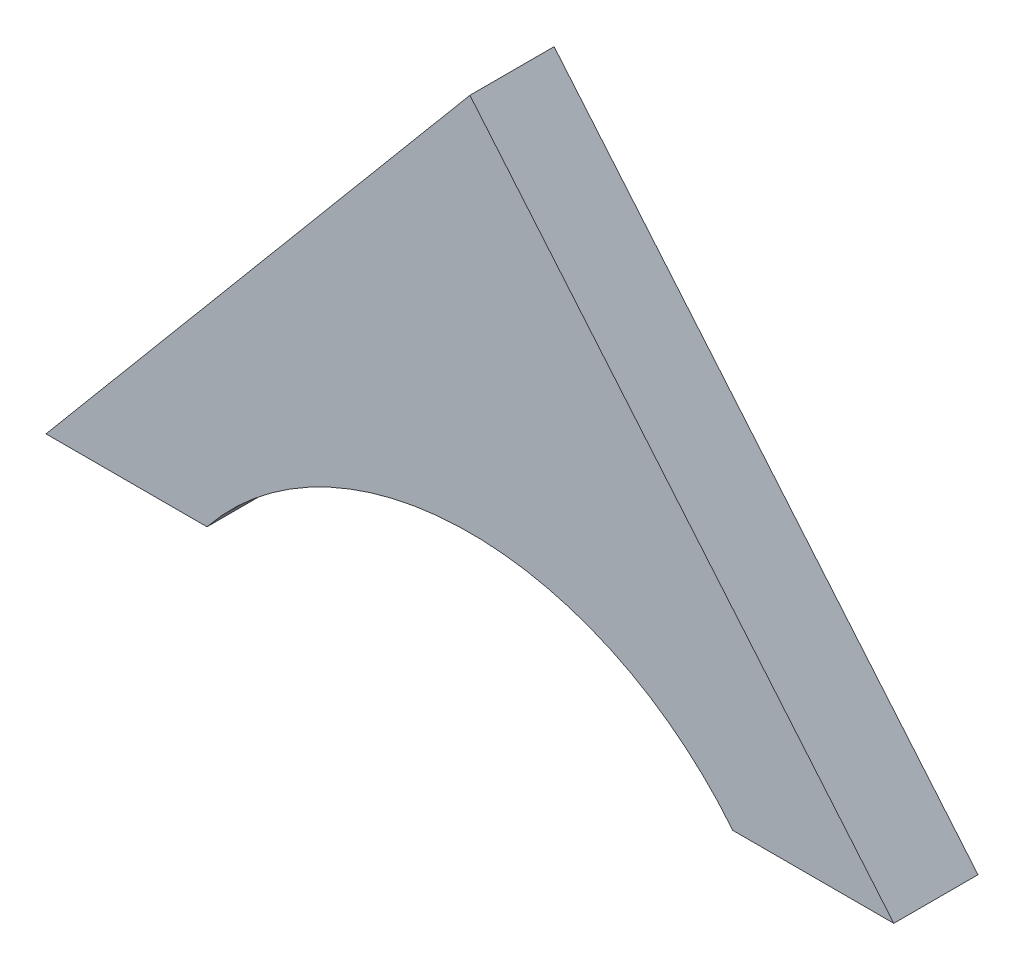
ISO-10303-21;
HEADER;
FILE_DESCRIPTION(('STEP AP214'),'2;1');
FILE_NAME('part.step','',(''),(''),'','','');
FILE_SCHEMA(('AUTOMOTIVE_DESIGN { 1 0 10303 214 1 1 1 1 }'));
ENDSEC;
DATA;
#1=APPLICATION_CONTEXT('core data for automotive mechanical design processes');
#2=APPLICATION_PROTOCOL_DEFINITION('international standard','automotive_design',2000,#1);
#3=PRODUCT_CONTEXT('',#1,'mechanical');
#4=PRODUCT('Part','Part','',(#3));
#5=PRODUCT_RELATED_PRODUCT_CATEGORY('part','',(#4));
#6=PRODUCT_DEFINITION_FORMATION('','',#4);
#7=PRODUCT_DEFINITION_CONTEXT('part definition',#1,'design');
#8=PRODUCT_DEFINITION('design','',#6,#7);
#9=PRODUCT_DEFINITION_SHAPE('','',#8);
#10=(LENGTH_UNIT() NAMED_UNIT(*) SI_UNIT(.MILLI.,.METRE.));
#11=(NAMED_UNIT(*) PLANE_ANGLE_UNIT() SI_UNIT($,.RADIAN.));
#12=(NAMED_UNIT(*) SI_UNIT($,.STERADIAN.) SOLID_ANGLE_UNIT());
#13=UNCERTAINTY_MEASURE_WITH_UNIT(LENGTH_MEASURE(1.E-05),#10,'distance_accuracy_value','');
#14=(GEOMETRIC_REPRESENTATION_CONTEXT(3) GLOBAL_UNCERTAINTY_ASSIGNED_CONTEXT((#13)) GLOBAL_UNIT_ASSIGNED_CONTEXT((#10,
#11,#12)) REPRESENTATION_CONTEXT('',''));
#15=CARTESIAN_POINT('',(0.,0.,0.));
#16=DIRECTION('',(0.,0.,1.));
#17=DIRECTION('',(1.,0.,0.));
#18=AXIS2_PLACEMENT_3D('',#15,#16,#17);
#19=CARTESIAN_POINT('',(0.,21.0330733535036,0.));
#20=DIRECTION('',(0.,0.,1.));
#21=DIRECTION('',(1.,0.,0.));
#22=AXIS2_PLACEMENT_3D('',#19,#20,#21);
#23=PLANE('',#22);
#24=DIRECTION('',(-0.642787609686539,-0.766044443118978,0.));
#25=VECTOR('',#24,1.);
#26=CARTESIAN_POINT('',(0.,60.,0.));
#27=LINE('',#26,#25);
#28=CARTESIAN_POINT('',(0.,60.,0.));
#29=VERTEX_POINT('',#28);
#30=CARTESIAN_POINT('',(-50.3459778706368,0.,0.));
#31=VERTEX_POINT('',#30);
#32=EDGE_CURVE('E28',#29,#31,#27,.T.);
#33=ORIENTED_EDGE('',*,*,#32,.F.);
#34=DIRECTION('',(-0.642787609686539,0.766044443118978,0.));
#35=VECTOR('',#34,1.);
#36=CARTESIAN_POINT('',(50.3459778706368,0.,0.));
#37=LINE('',#36,#35);
#38=CARTESIAN_POINT('',(50.3459778706368,0.,0.));
#39=VERTEX_POINT('',#38);
#40=EDGE_CURVE('E91',#39,#29,#37,.T.);
#41=ORIENTED_EDGE('',*,*,#40,.F.);
#42=DIRECTION('',(1.,0.,0.));
#43=VECTOR('',#42,1.);
#44=CARTESIAN_POINT('',(31.224989991992,0.,0.));
#45=LINE('',#44,#43);
#46=CARTESIAN_POINT('',(31.224989991992,0.,0.));
#47=VERTEX_POINT('',#46);
#48=EDGE_CURVE('E21',#47,#39,#45,.T.);
#49=ORIENTED_EDGE('',*,*,#48,.F.);
#50=CARTESIAN_POINT('',(0.,-25.,0.));
#51=DIRECTION('',(0.,0.,-1.));
#52=DIRECTION('',(-0.7806247497998,-0.625,0.));
#53=AXIS2_PLACEMENT_3D('',#50,#51,#52);
#54=CIRCLE('',#53,40.);
#55=CARTESIAN_POINT('',(-31.224989991992,0.,0.));
#56=VERTEX_POINT('',#55);
#57=EDGE_CURVE('E107',#56,#47,#54,.T.);
#58=ORIENTED_EDGE('',*,*,#57,.F.);
#59=DIRECTION('',(1.,0.,0.));
#60=VECTOR('',#59,1.);
#61=CARTESIAN_POINT('',(-50.3459778706368,0.,0.));
#62=LINE('',#61,#60);
#63=EDGE_CURVE('E123',#31,#56,#62,.T.);
#64=ORIENTED_EDGE('',*,*,#63,.F.);
#65=EDGE_LOOP('',(#33,#41,#49,#58,#64));
#66=FACE_BOUND('',#65,.T.);
#67=ADVANCED_FACE('F17',(#66),#23,.F.);
#68=CARTESIAN_POINT('',(0.,21.0330733535036,10.));
#69=DIRECTION('',(0.,0.,1.));
#70=DIRECTION('',(1.,0.,0.));
#71=AXIS2_PLACEMENT_3D('',#68,#69,#70);
#72=PLANE('',#71);
#73=DIRECTION('',(-0.642787609686539,-0.766044443118978,0.));
#74=VECTOR('',#73,1.);
#75=CARTESIAN_POINT('',(0.,60.,10.));
#76=LINE('',#75,#74);
#77=CARTESIAN_POINT('',(0.,60.,10.));
#78=VERTEX_POINT('',#77);
#79=CARTESIAN_POINT('',(-50.3459778706368,0.,10.));
#80=VERTEX_POINT('',#79);
#81=EDGE_CURVE('E11',#78,#80,#76,.T.);
#82=ORIENTED_EDGE('',*,*,#81,.T.);
#83=DIRECTION('',(1.,0.,0.));
#84=VECTOR('',#83,1.);
#85=CARTESIAN_POINT('',(-50.3459778706368,0.,10.));
#86=LINE('',#85,#84);
#87=CARTESIAN_POINT('',(-31.224989991992,0.,10.));
#88=VERTEX_POINT('',#87);
#89=EDGE_CURVE('E101',#80,#88,#86,.T.);
#90=ORIENTED_EDGE('',*,*,#89,.T.);
#91=CARTESIAN_POINT('',(0.,-25.,10.));
#92=DIRECTION('',(0.,0.,-1.));
#93=DIRECTION('',(-0.7806247497998,-0.625,0.));
#94=AXIS2_PLACEMENT_3D('',#91,#92,#93);
#95=CIRCLE('',#94,40.);
#96=CARTESIAN_POINT('',(31.224989991992,0.,10.));
#97=VERTEX_POINT('',#96);
#98=EDGE_CURVE('E104',#88,#97,#95,.T.);
#99=ORIENTED_EDGE('',*,*,#98,.T.);
#100=DIRECTION('',(1.,0.,0.));
#101=VECTOR('',#100,1.);
#102=CARTESIAN_POINT('',(31.224989991992,0.,10.));
#103=LINE('',#102,#101);
#104=CARTESIAN_POINT('',(50.3459778706368,0.,10.));
#105=VERTEX_POINT('',#104);
#106=EDGE_CURVE('E82',#97,#105,#103,.T.);
#107=ORIENTED_EDGE('',*,*,#106,.T.);
#108=DIRECTION('',(-0.642787609686539,0.766044443118978,0.));
#109=VECTOR('',#108,1.);
#110=CARTESIAN_POINT('',(50.3459778706368,0.,10.));
#111=LINE('',#110,#109);
#112=EDGE_CURVE('E80',#105,#78,#111,.T.);
#113=ORIENTED_EDGE('',*,*,#112,.T.);
#114=EDGE_LOOP('',(#82,#90,#99,#107,#113));
#115=FACE_BOUND('',#114,.T.);
#116=ADVANCED_FACE('F19',(#115),#72,.T.);
#117=CARTESIAN_POINT('',(0.,60.,0.));
#118=DIRECTION('',(-0.766044443118978,0.642787609686539,0.));
#119=DIRECTION('',(0.,0.,1.));
#120=AXIS2_PLACEMENT_3D('',#117,#118,#119);
#121=PLANE('',#120);
#122=ORIENTED_EDGE('',*,*,#32,.T.);
#123=DIRECTION('',(0.,0.,1.));
#124=VECTOR('',#123,1.);
#125=CARTESIAN_POINT('',(-50.3459778706368,0.,0.));
#126=LINE('',#125,#124);
#127=EDGE_CURVE('E77',#31,#80,#126,.T.);
#128=ORIENTED_EDGE('',*,*,#127,.T.);
#129=ORIENTED_EDGE('',*,*,#81,.F.);
#130=DIRECTION('',(0.,0.,1.));
#131=VECTOR('',#130,1.);
#132=CARTESIAN_POINT('',(0.,60.,0.));
#133=LINE('',#132,#131);
#134=EDGE_CURVE('E74',#29,#78,#133,.T.);
#135=ORIENTED_EDGE('',*,*,#134,.F.);
#136=EDGE_LOOP('',(#122,#128,#129,#135));
#137=FACE_BOUND('',#136,.T.);
#138=ADVANCED_FACE('F72',(#137),#121,.T.);
#139=CARTESIAN_POINT('',(-50.3459778706368,0.,0.));
#140=DIRECTION('',(0.,-1.,0.));
#141=DIRECTION('',(0.,0.,-1.));
#142=AXIS2_PLACEMENT_3D('',#139,#140,#141);
#143=PLANE('',#142);
#144=ORIENTED_EDGE('',*,*,#63,.T.);
#145=DIRECTION('',(0.,0.,1.));
#146=VECTOR('',#145,1.);
#147=CARTESIAN_POINT('',(-31.224989991992,0.,0.));
#148=LINE('',#147,#146);
#149=EDGE_CURVE('E106',#56,#88,#148,.T.);
#150=ORIENTED_EDGE('',*,*,#149,.T.);
#151=ORIENTED_EDGE('',*,*,#89,.F.);
#152=ORIENTED_EDGE('',*,*,#127,.F.);
#153=EDGE_LOOP('',(#144,#150,#151,#152));
#154=FACE_BOUND('',#153,.T.);
#155=ADVANCED_FACE('F138',(#154),#143,.T.);
#156=CARTESIAN_POINT('',(0.,-25.,0.));
#157=DIRECTION('',(0.,0.,1.));
#158=DIRECTION('',(-0.7806247497998,-0.625,0.));
#159=AXIS2_PLACEMENT_3D('',#156,#157,#158);
#160=CYLINDRICAL_SURFACE('',#159,40.);
#161=ORIENTED_EDGE('',*,*,#57,.T.);
#162=DIRECTION('',(0.,0.,1.));
#163=VECTOR('',#162,1.);
#164=CARTESIAN_POINT('',(31.224989991992,0.,0.));
#165=LINE('',#164,#163);
#166=EDGE_CURVE('E112',#47,#97,#165,.T.);
#167=ORIENTED_EDGE('',*,*,#166,.T.);
#168=ORIENTED_EDGE('',*,*,#98,.F.);
#169=ORIENTED_EDGE('',*,*,#149,.F.);
#170=EDGE_LOOP('',(#161,#167,#168,#169));
#171=FACE_BOUND('',#170,.T.);
#172=ADVANCED_FACE('F142',(#171),#160,.F.);
#173=CARTESIAN_POINT('',(31.224989991992,0.,0.));
#174=DIRECTION('',(0.,-1.,0.));
#175=DIRECTION('',(-1.,0.,0.));
#176=AXIS2_PLACEMENT_3D('',#173,#174,#175);
#177=PLANE('',#176);
#178=ORIENTED_EDGE('',*,*,#48,.T.);
#179=DIRECTION('',(0.,0.,1.));
#180=VECTOR('',#179,1.);
#181=CARTESIAN_POINT('',(50.3459778706368,0.,0.));
#182=LINE('',#181,#180);
#183=EDGE_CURVE('E87',#39,#105,#182,.T.);
#184=ORIENTED_EDGE('',*,*,#183,.T.);
#185=ORIENTED_EDGE('',*,*,#106,.F.);
#186=ORIENTED_EDGE('',*,*,#166,.F.);
#187=EDGE_LOOP('',(#178,#184,#185,#186));
#188=FACE_BOUND('',#187,.T.);
#189=ADVANCED_FACE('F190',(#188),#177,.T.);
#190=CARTESIAN_POINT('',(50.3459778706368,0.,0.));
#191=DIRECTION('',(0.766044443118978,0.642787609686539,0.));
#192=DIRECTION('',(0.,0.,-1.));
#193=AXIS2_PLACEMENT_3D('',#190,#191,#192);
#194=PLANE('',#193);
#195=ORIENTED_EDGE('',*,*,#40,.T.);
#196=ORIENTED_EDGE('',*,*,#134,.T.);
#197=ORIENTED_EDGE('',*,*,#112,.F.);
#198=ORIENTED_EDGE('',*,*,#183,.F.);
#199=EDGE_LOOP('',(#195,#196,#197,#198));
#200=FACE_BOUND('',#199,.T.);
#201=ADVANCED_FACE('F89',(#200),#194,.T.);
#202=CLOSED_SHELL('',(#67,#116,#138,#155,#172,#189,#201));
#203=MANIFOLD_SOLID_BREP('B1',#202);
#204=ADVANCED_BREP_SHAPE_REPRESENTATION('',(#18,#203),#14);
#205=SHAPE_DEFINITION_REPRESENTATION(#9,#204);
ENDSEC;
END-ISO-10303-21;
